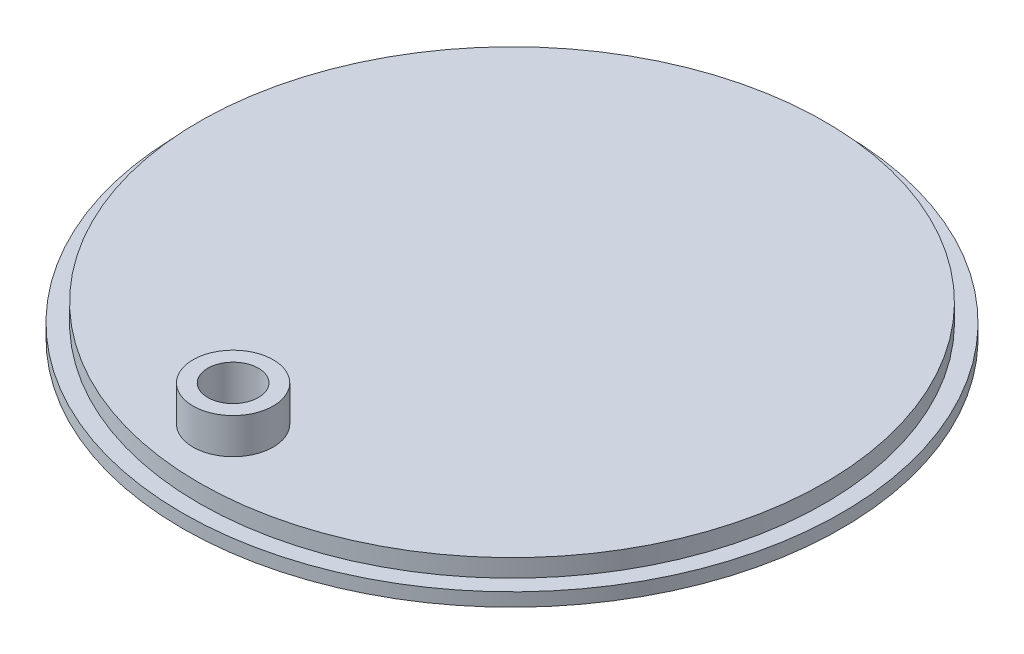
ISO-10303-21;
HEADER;
FILE_DESCRIPTION(('STEP AP214'),'2;1');
FILE_NAME('part.step','',(''),(''),'','','');
FILE_SCHEMA(('AUTOMOTIVE_DESIGN { 1 0 10303 214 1 1 1 1 }'));
ENDSEC;
DATA;
#1=APPLICATION_CONTEXT('core data for automotive mechanical design processes');
#2=APPLICATION_PROTOCOL_DEFINITION('international standard','automotive_design',2000,#1);
#3=PRODUCT_CONTEXT('',#1,'mechanical');
#4=PRODUCT('Part','Part','',(#3));
#5=PRODUCT_RELATED_PRODUCT_CATEGORY('part','',(#4));
#6=PRODUCT_DEFINITION_FORMATION('','',#4);
#7=PRODUCT_DEFINITION_CONTEXT('part definition',#1,'design');
#8=PRODUCT_DEFINITION('design','',#6,#7);
#9=PRODUCT_DEFINITION_SHAPE('','',#8);
#10=(LENGTH_UNIT() NAMED_UNIT(*) SI_UNIT(.MILLI.,.METRE.));
#11=(NAMED_UNIT(*) PLANE_ANGLE_UNIT() SI_UNIT($,.RADIAN.));
#12=(NAMED_UNIT(*) SI_UNIT($,.STERADIAN.) SOLID_ANGLE_UNIT());
#13=UNCERTAINTY_MEASURE_WITH_UNIT(LENGTH_MEASURE(1.E-05),#10,'distance_accuracy_value','');
#14=(GEOMETRIC_REPRESENTATION_CONTEXT(3) GLOBAL_UNCERTAINTY_ASSIGNED_CONTEXT((#13)) GLOBAL_UNIT_ASSIGNED_CONTEXT((#10,
#11,#12)) REPRESENTATION_CONTEXT('',''));
#15=CARTESIAN_POINT('',(0.,0.,0.));
#16=DIRECTION('',(0.,0.,1.));
#17=DIRECTION('',(1.,0.,0.));
#18=AXIS2_PLACEMENT_3D('',#15,#16,#17);
#19=CARTESIAN_POINT('',(0.,4.,0.));
#20=DIRECTION('',(0.,-1.,0.));
#21=DIRECTION('',(0.,0.,-1.));
#22=AXIS2_PLACEMENT_3D('',#19,#20,#21);
#23=CYLINDRICAL_SURFACE('',#22,70.25);
#24=CARTESIAN_POINT('',(0.,4.,0.));
#25=DIRECTION('',(0.,1.,0.));
#26=DIRECTION('',(0.,0.,1.));
#27=AXIS2_PLACEMENT_3D('',#24,#25,#26);
#28=CIRCLE('',#27,70.25);
#29=CARTESIAN_POINT('',(0.,4.,70.25));
#30=VERTEX_POINT('',#29);
#31=EDGE_CURVE('E10',#30,#30,#28,.T.);
#32=ORIENTED_EDGE('',*,*,#31,.F.);
#33=EDGE_LOOP('',(#32));
#34=FACE_BOUND('',#33,.T.);
#35=CARTESIAN_POINT('',(0.,0.,0.));
#36=DIRECTION('',(0.,1.,0.));
#37=DIRECTION('',(0.,0.,1.));
#38=AXIS2_PLACEMENT_3D('',#35,#36,#37);
#39=CIRCLE('',#38,70.25);
#40=CARTESIAN_POINT('',(0.,0.,70.25));
#41=VERTEX_POINT('',#40);
#42=EDGE_CURVE('E45',#41,#41,#39,.T.);
#43=ORIENTED_EDGE('',*,*,#42,.T.);
#44=EDGE_LOOP('',(#43));
#45=FACE_BOUND('',#44,.T.);
#46=ADVANCED_FACE('F37',(#34,#45),#23,.T.);
#47=CARTESIAN_POINT('',(0.,4.,0.));
#48=DIRECTION('',(0.,1.,0.));
#49=DIRECTION('',(0.,0.,1.));
#50=AXIS2_PLACEMENT_3D('',#47,#48,#49);
#51=PLANE('',#50);
#52=CARTESIAN_POINT('',(-7.62500108354572,4.,55.));
#53=DIRECTION('',(0.,1.,0.));
#54=DIRECTION('',(0.,0.,1.));
#55=AXIS2_PLACEMENT_3D('',#52,#53,#54);
#56=CIRCLE('',#55,9.);
#57=CARTESIAN_POINT('',(-7.62500108354572,4.,64.));
#58=VERTEX_POINT('',#57);
#59=EDGE_CURVE('E61',#58,#58,#56,.T.);
#60=ORIENTED_EDGE('',*,*,#59,.F.);
#61=EDGE_LOOP('',(#60));
#62=FACE_BOUND('',#61,.T.);
#63=ORIENTED_EDGE('',*,*,#31,.T.);
#64=EDGE_LOOP('',(#63));
#65=FACE_BOUND('',#64,.T.);
#66=ADVANCED_FACE('F110',(#62,#65),#51,.T.);
#67=CARTESIAN_POINT('',(0.,-3.,0.));
#68=DIRECTION('',(0.,1.,0.));
#69=DIRECTION('',(0.,0.,1.));
#70=AXIS2_PLACEMENT_3D('',#67,#68,#69);
#71=CYLINDRICAL_SURFACE('',#70,74.);
#72=CARTESIAN_POINT('',(0.,-3.,0.));
#73=DIRECTION('',(0.,-1.,0.));
#74=DIRECTION('',(0.,0.,-1.));
#75=AXIS2_PLACEMENT_3D('',#72,#73,#74);
#76=CIRCLE('',#75,74.);
#77=CARTESIAN_POINT('',(0.,-3.,-74.));
#78=VERTEX_POINT('',#77);
#79=EDGE_CURVE('E51',#78,#78,#76,.T.);
#80=ORIENTED_EDGE('',*,*,#79,.F.);
#81=EDGE_LOOP('',(#80));
#82=FACE_BOUND('',#81,.T.);
#83=CARTESIAN_POINT('',(0.,0.,0.));
#84=DIRECTION('',(0.,-1.,0.));
#85=DIRECTION('',(0.,0.,-1.));
#86=AXIS2_PLACEMENT_3D('',#83,#84,#85);
#87=CIRCLE('',#86,74.);
#88=CARTESIAN_POINT('',(0.,0.,-74.));
#89=VERTEX_POINT('',#88);
#90=EDGE_CURVE('E53',#89,#89,#87,.T.);
#91=ORIENTED_EDGE('',*,*,#90,.T.);
#92=EDGE_LOOP('',(#91));
#93=FACE_BOUND('',#92,.T.);
#94=ADVANCED_FACE('F104',(#82,#93),#71,.T.);
#95=CARTESIAN_POINT('',(0.,-3.,0.));
#96=DIRECTION('',(0.,-1.,0.));
#97=DIRECTION('',(0.,0.,-1.));
#98=AXIS2_PLACEMENT_3D('',#95,#96,#97);
#99=PLANE('',#98);
#100=CARTESIAN_POINT('',(-7.62500108354572,-3.,55.));
#101=DIRECTION('',(0.,-1.,0.));
#102=DIRECTION('',(0.,0.,-1.));
#103=AXIS2_PLACEMENT_3D('',#100,#101,#102);
#104=CIRCLE('',#103,7.);
#105=CARTESIAN_POINT('',(-7.62500108354572,-3.,48.));
#106=VERTEX_POINT('',#105);
#107=EDGE_CURVE('E69',#106,#106,#104,.T.);
#108=ORIENTED_EDGE('',*,*,#107,.F.);
#109=EDGE_LOOP('',(#108));
#110=FACE_BOUND('',#109,.T.);
#111=ORIENTED_EDGE('',*,*,#79,.T.);
#112=EDGE_LOOP('',(#111));
#113=FACE_BOUND('',#112,.T.);
#114=ADVANCED_FACE('F100',(#110,#113),#99,.T.);
#115=CARTESIAN_POINT('',(0.,0.,0.));
#116=DIRECTION('',(0.,-1.,0.));
#117=DIRECTION('',(0.,0.,-1.));
#118=AXIS2_PLACEMENT_3D('',#115,#116,#117);
#119=PLANE('',#118);
#120=ORIENTED_EDGE('',*,*,#42,.F.);
#121=EDGE_LOOP('',(#120));
#122=FACE_BOUND('',#121,.T.);
#123=ORIENTED_EDGE('',*,*,#90,.F.);
#124=EDGE_LOOP('',(#123));
#125=FACE_BOUND('',#124,.T.);
#126=ADVANCED_FACE('F103',(#122,#125),#119,.F.);
#127=CARTESIAN_POINT('',(-7.62500108354572,12.,55.));
#128=DIRECTION('',(0.,-1.,0.));
#129=DIRECTION('',(0.,0.,-1.));
#130=AXIS2_PLACEMENT_3D('',#127,#128,#129);
#131=CYLINDRICAL_SURFACE('',#130,9.);
#132=CARTESIAN_POINT('',(-7.62500108354572,12.,55.));
#133=DIRECTION('',(0.,1.,0.));
#134=DIRECTION('',(0.,0.,1.));
#135=AXIS2_PLACEMENT_3D('',#132,#133,#134);
#136=CIRCLE('',#135,9.);
#137=CARTESIAN_POINT('',(-7.62500108354572,12.,64.));
#138=VERTEX_POINT('',#137);
#139=EDGE_CURVE('E57',#138,#138,#136,.T.);
#140=ORIENTED_EDGE('',*,*,#139,.F.);
#141=EDGE_LOOP('',(#140));
#142=FACE_BOUND('',#141,.T.);
#143=ORIENTED_EDGE('',*,*,#59,.T.);
#144=EDGE_LOOP('',(#143));
#145=FACE_BOUND('',#144,.T.);
#146=ADVANCED_FACE('F115',(#142,#145),#131,.T.);
#147=CARTESIAN_POINT('',(-7.62500108354572,12.,55.));
#148=DIRECTION('',(0.,1.,0.));
#149=DIRECTION('',(0.,0.,1.));
#150=AXIS2_PLACEMENT_3D('',#147,#148,#149);
#151=PLANE('',#150);
#152=CARTESIAN_POINT('',(-7.62500108354572,12.,55.));
#153=DIRECTION('',(0.,1.,0.));
#154=DIRECTION('',(0.,0.,1.));
#155=AXIS2_PLACEMENT_3D('',#152,#153,#154);
#156=CIRCLE('',#155,5.7);
#157=CARTESIAN_POINT('',(-7.62500108354572,12.,60.7));
#158=VERTEX_POINT('',#157);
#159=EDGE_CURVE('E76',#158,#158,#156,.T.);
#160=ORIENTED_EDGE('',*,*,#159,.F.);
#161=EDGE_LOOP('',(#160));
#162=FACE_BOUND('',#161,.T.);
#163=ORIENTED_EDGE('',*,*,#139,.T.);
#164=EDGE_LOOP('',(#163));
#165=FACE_BOUND('',#164,.T.);
#166=ADVANCED_FACE('F96',(#162,#165),#151,.T.);
#167=CARTESIAN_POINT('',(-7.62500108354572,0.5,55.));
#168=DIRECTION('',(0.,-1.,0.));
#169=DIRECTION('',(0.,0.,-1.));
#170=AXIS2_PLACEMENT_3D('',#167,#168,#169);
#171=CYLINDRICAL_SURFACE('',#170,7.);
#172=CARTESIAN_POINT('',(-7.62500108354572,0.5,55.));
#173=DIRECTION('',(0.,-1.,0.));
#174=DIRECTION('',(0.,0.,-1.));
#175=AXIS2_PLACEMENT_3D('',#172,#173,#174);
#176=CIRCLE('',#175,7.);
#177=CARTESIAN_POINT('',(-7.62500108354572,0.5,48.));
#178=VERTEX_POINT('',#177);
#179=EDGE_CURVE('E65',#178,#178,#176,.T.);
#180=ORIENTED_EDGE('',*,*,#179,.F.);
#181=EDGE_LOOP('',(#180));
#182=FACE_BOUND('',#181,.T.);
#183=ORIENTED_EDGE('',*,*,#107,.T.);
#184=EDGE_LOOP('',(#183));
#185=FACE_BOUND('',#184,.T.);
#186=ADVANCED_FACE('F90',(#182,#185),#171,.F.);
#187=CARTESIAN_POINT('',(-7.62500108354572,0.5,55.));
#188=DIRECTION('',(0.,-1.,0.));
#189=DIRECTION('',(0.,0.,-1.));
#190=AXIS2_PLACEMENT_3D('',#187,#188,#189);
#191=PLANE('',#190);
#192=CARTESIAN_POINT('',(-7.62500108354572,0.5,55.));
#193=DIRECTION('',(0.,-1.,0.));
#194=DIRECTION('',(0.,0.,-1.));
#195=AXIS2_PLACEMENT_3D('',#192,#193,#194);
#196=CIRCLE('',#195,5.7);
#197=CARTESIAN_POINT('',(-7.62500108354572,0.5,49.3));
#198=VERTEX_POINT('',#197);
#199=EDGE_CURVE('E40',#198,#198,#196,.T.);
#200=ORIENTED_EDGE('',*,*,#199,.F.);
#201=EDGE_LOOP('',(#200));
#202=FACE_BOUND('',#201,.T.);
#203=ORIENTED_EDGE('',*,*,#179,.T.);
#204=EDGE_LOOP('',(#203));
#205=FACE_BOUND('',#204,.T.);
#206=ADVANCED_FACE('F87',(#202,#205),#191,.T.);
#207=CARTESIAN_POINT('',(-7.62500108354572,-3.,55.));
#208=DIRECTION('',(0.,1.,0.));
#209=DIRECTION('',(0.,0.,1.));
#210=AXIS2_PLACEMENT_3D('',#207,#208,#209);
#211=CYLINDRICAL_SURFACE('',#210,5.7);
#212=ORIENTED_EDGE('',*,*,#199,.T.);
#213=EDGE_LOOP('',(#212));
#214=FACE_BOUND('',#213,.T.);
#215=ORIENTED_EDGE('',*,*,#159,.T.);
#216=EDGE_LOOP('',(#215));
#217=FACE_BOUND('',#216,.T.);
#218=ADVANCED_FACE('F85',(#214,#217),#211,.F.);
#219=CLOSED_SHELL('',(#46,#66,#94,#114,#126,#146,#166,#186,#206,#218));
#220=MANIFOLD_SOLID_BREP('B2',#219);
#221=ADVANCED_BREP_SHAPE_REPRESENTATION('',(#18,#220),#14);
#222=SHAPE_DEFINITION_REPRESENTATION(#9,#221);
ENDSEC;
END-ISO-10303-21;
